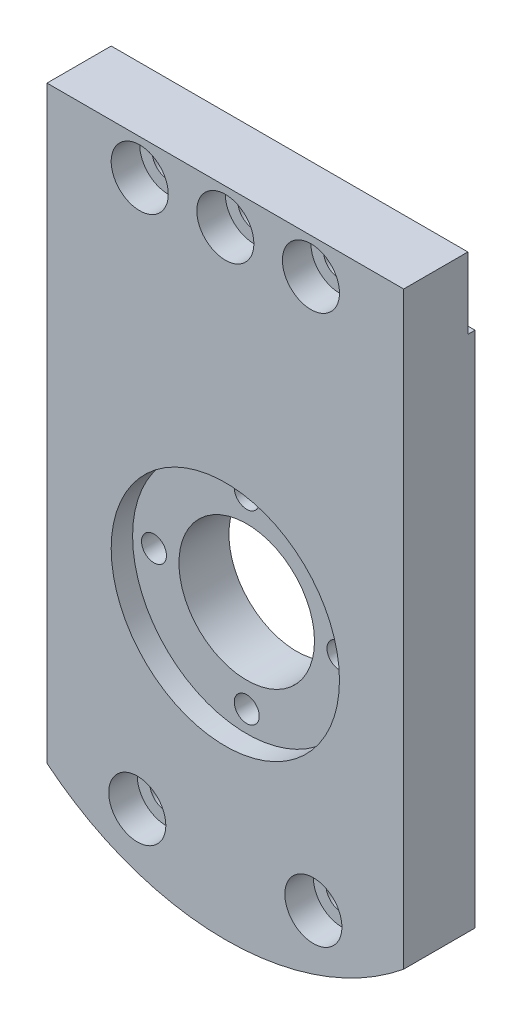
ISO-10303-21;
HEADER;
FILE_DESCRIPTION(('STEP AP214'),'2;1');
FILE_NAME('part.step','',(''),(''),'','','');
FILE_SCHEMA(('AUTOMOTIVE_DESIGN { 1 0 10303 214 1 1 1 1 }'));
ENDSEC;
DATA;
#1=APPLICATION_CONTEXT('core data for automotive mechanical design processes');
#2=APPLICATION_PROTOCOL_DEFINITION('international standard','automotive_design',2000,#1);
#3=PRODUCT_CONTEXT('',#1,'mechanical');
#4=PRODUCT('Part','Part','',(#3));
#5=PRODUCT_RELATED_PRODUCT_CATEGORY('part','',(#4));
#6=PRODUCT_DEFINITION_FORMATION('','',#4);
#7=PRODUCT_DEFINITION_CONTEXT('part definition',#1,'design');
#8=PRODUCT_DEFINITION('design','',#6,#7);
#9=PRODUCT_DEFINITION_SHAPE('','',#8);
#10=(LENGTH_UNIT() NAMED_UNIT(*) SI_UNIT(.MILLI.,.METRE.));
#11=(NAMED_UNIT(*) PLANE_ANGLE_UNIT() SI_UNIT($,.RADIAN.));
#12=(NAMED_UNIT(*) SI_UNIT($,.STERADIAN.) SOLID_ANGLE_UNIT());
#13=UNCERTAINTY_MEASURE_WITH_UNIT(LENGTH_MEASURE(1.E-05),#10,'distance_accuracy_value','');
#14=(GEOMETRIC_REPRESENTATION_CONTEXT(3) GLOBAL_UNCERTAINTY_ASSIGNED_CONTEXT((#13)) GLOBAL_UNIT_ASSIGNED_CONTEXT((#10,
#11,#12)) REPRESENTATION_CONTEXT('',''));
#15=CARTESIAN_POINT('',(0.,0.,0.));
#16=DIRECTION('',(0.,0.,1.));
#17=DIRECTION('',(1.,0.,0.));
#18=AXIS2_PLACEMENT_3D('',#15,#16,#17);
#19=CARTESIAN_POINT('',(13.,0.,10.));
#20=DIRECTION('',(0.,0.,-1.));
#21=DIRECTION('',(-1.,0.,0.));
#22=AXIS2_PLACEMENT_3D('',#19,#20,#21);
#23=CYLINDRICAL_SURFACE('',#22,1.75);
#24=CARTESIAN_POINT('',(13.,0.,7.));
#25=DIRECTION('',(0.,0.,1.));
#26=DIRECTION('',(1.,0.,0.));
#27=AXIS2_PLACEMENT_3D('',#24,#25,#26);
#28=CIRCLE('',#27,1.75);
#29=CARTESIAN_POINT('',(14.75,0.,7.));
#30=VERTEX_POINT('',#29);
#31=EDGE_CURVE('E172',#30,#30,#28,.T.);
#32=ORIENTED_EDGE('',*,*,#31,.T.);
#33=EDGE_LOOP('',(#32));
#34=FACE_BOUND('',#33,.T.);
#35=CARTESIAN_POINT('',(13.,0.,2.));
#36=DIRECTION('',(0.,0.,-1.));
#37=DIRECTION('',(-1.,0.,0.));
#38=AXIS2_PLACEMENT_3D('',#35,#36,#37);
#39=CIRCLE('',#38,1.75);
#40=CARTESIAN_POINT('',(11.25,0.,2.));
#41=VERTEX_POINT('',#40);
#42=EDGE_CURVE('E36',#41,#41,#39,.T.);
#43=ORIENTED_EDGE('',*,*,#42,.T.);
#44=EDGE_LOOP('',(#43));
#45=FACE_BOUND('',#44,.T.);
#46=ADVANCED_FACE('F32',(#34,#45),#23,.F.);
#47=CARTESIAN_POINT('',(0.,-13.,10.));
#48=DIRECTION('',(0.,0.,-1.));
#49=DIRECTION('',(-1.,0.,0.));
#50=AXIS2_PLACEMENT_3D('',#47,#48,#49);
#51=CYLINDRICAL_SURFACE('',#50,1.75);
#52=CARTESIAN_POINT('',(0.,-13.,7.));
#53=DIRECTION('',(0.,0.,1.));
#54=DIRECTION('',(1.,0.,0.));
#55=AXIS2_PLACEMENT_3D('',#52,#53,#54);
#56=CIRCLE('',#55,1.75);
#57=CARTESIAN_POINT('',(1.75,-13.,7.));
#58=VERTEX_POINT('',#57);
#59=EDGE_CURVE('E168',#58,#58,#56,.T.);
#60=ORIENTED_EDGE('',*,*,#59,.T.);
#61=EDGE_LOOP('',(#60));
#62=FACE_BOUND('',#61,.T.);
#63=CARTESIAN_POINT('',(0.,-13.,2.));
#64=DIRECTION('',(0.,0.,-1.));
#65=DIRECTION('',(-1.,0.,0.));
#66=AXIS2_PLACEMENT_3D('',#63,#64,#65);
#67=CIRCLE('',#66,1.75);
#68=CARTESIAN_POINT('',(-1.75,-13.,2.));
#69=VERTEX_POINT('',#68);
#70=EDGE_CURVE('E228',#69,#69,#67,.T.);
#71=ORIENTED_EDGE('',*,*,#70,.T.);
#72=EDGE_LOOP('',(#71));
#73=FACE_BOUND('',#72,.T.);
#74=ADVANCED_FACE('F267',(#62,#73),#51,.F.);
#75=CARTESIAN_POINT('',(-13.,0.,10.));
#76=DIRECTION('',(0.,0.,-1.));
#77=DIRECTION('',(-1.,0.,0.));
#78=AXIS2_PLACEMENT_3D('',#75,#76,#77);
#79=CYLINDRICAL_SURFACE('',#78,1.75);
#80=CARTESIAN_POINT('',(-13.,0.,7.));
#81=DIRECTION('',(0.,0.,1.));
#82=DIRECTION('',(1.,0.,0.));
#83=AXIS2_PLACEMENT_3D('',#80,#81,#82);
#84=CIRCLE('',#83,1.75);
#85=CARTESIAN_POINT('',(-11.25,0.,7.));
#86=VERTEX_POINT('',#85);
#87=EDGE_CURVE('E178',#86,#86,#84,.T.);
#88=ORIENTED_EDGE('',*,*,#87,.T.);
#89=EDGE_LOOP('',(#88));
#90=FACE_BOUND('',#89,.T.);
#91=CARTESIAN_POINT('',(-13.,0.,2.));
#92=DIRECTION('',(0.,0.,-1.));
#93=DIRECTION('',(-1.,0.,0.));
#94=AXIS2_PLACEMENT_3D('',#91,#92,#93);
#95=CIRCLE('',#94,1.75);
#96=CARTESIAN_POINT('',(-14.75,0.,2.));
#97=VERTEX_POINT('',#96);
#98=EDGE_CURVE('E224',#97,#97,#95,.T.);
#99=ORIENTED_EDGE('',*,*,#98,.T.);
#100=EDGE_LOOP('',(#99));
#101=FACE_BOUND('',#100,.T.);
#102=ADVANCED_FACE('F273',(#90,#101),#79,.F.);
#103=CARTESIAN_POINT('',(0.,13.,10.));
#104=DIRECTION('',(0.,0.,-1.));
#105=DIRECTION('',(-1.,0.,0.));
#106=AXIS2_PLACEMENT_3D('',#103,#104,#105);
#107=CYLINDRICAL_SURFACE('',#106,1.75);
#108=CARTESIAN_POINT('',(0.,13.,7.));
#109=DIRECTION('',(0.,0.,1.));
#110=DIRECTION('',(1.,0.,0.));
#111=AXIS2_PLACEMENT_3D('',#108,#109,#110);
#112=CIRCLE('',#111,1.75);
#113=CARTESIAN_POINT('',(1.75,13.,7.));
#114=VERTEX_POINT('',#113);
#115=EDGE_CURVE('E175',#114,#114,#112,.T.);
#116=ORIENTED_EDGE('',*,*,#115,.T.);
#117=EDGE_LOOP('',(#116));
#118=FACE_BOUND('',#117,.T.);
#119=CARTESIAN_POINT('',(0.,13.,2.));
#120=DIRECTION('',(0.,0.,-1.));
#121=DIRECTION('',(-1.,0.,0.));
#122=AXIS2_PLACEMENT_3D('',#119,#120,#121);
#123=CIRCLE('',#122,1.75);
#124=CARTESIAN_POINT('',(-1.75,13.,2.));
#125=VERTEX_POINT('',#124);
#126=EDGE_CURVE('E220',#125,#125,#123,.T.);
#127=ORIENTED_EDGE('',*,*,#126,.T.);
#128=EDGE_LOOP('',(#127));
#129=FACE_BOUND('',#128,.T.);
#130=ADVANCED_FACE('F279',(#118,#129),#107,.F.);
#131=CARTESIAN_POINT('',(12.,47.,10.));
#132=DIRECTION('',(0.,0.,-1.));
#133=DIRECTION('',(-1.,0.,0.));
#134=AXIS2_PLACEMENT_3D('',#131,#132,#133);
#135=CYLINDRICAL_SURFACE('',#134,2.25);
#136=CARTESIAN_POINT('',(12.,47.,6.));
#137=DIRECTION('',(0.,0.,1.));
#138=DIRECTION('',(1.,0.,0.));
#139=AXIS2_PLACEMENT_3D('',#136,#137,#138);
#140=CIRCLE('',#139,2.25);
#141=CARTESIAN_POINT('',(14.25,47.,6.));
#142=VERTEX_POINT('',#141);
#143=EDGE_CURVE('E147',#142,#142,#140,.T.);
#144=ORIENTED_EDGE('',*,*,#143,.T.);
#145=EDGE_LOOP('',(#144));
#146=FACE_BOUND('',#145,.T.);
#147=CARTESIAN_POINT('',(12.,47.,0.999999999999999));
#148=DIRECTION('',(0.,0.,-1.));
#149=DIRECTION('',(-1.,0.,0.));
#150=AXIS2_PLACEMENT_3D('',#147,#148,#149);
#151=CIRCLE('',#150,2.25);
#152=CARTESIAN_POINT('',(9.75,47.,0.999999999999999));
#153=VERTEX_POINT('',#152);
#154=EDGE_CURVE('E127',#153,#153,#151,.T.);
#155=ORIENTED_EDGE('',*,*,#154,.T.);
#156=EDGE_LOOP('',(#155));
#157=FACE_BOUND('',#156,.T.);
#158=ADVANCED_FACE('F282',(#146,#157),#135,.F.);
#159=CARTESIAN_POINT('',(0.,47.,10.));
#160=DIRECTION('',(0.,0.,-1.));
#161=DIRECTION('',(-1.,0.,0.));
#162=AXIS2_PLACEMENT_3D('',#159,#160,#161);
#163=CYLINDRICAL_SURFACE('',#162,2.25);
#164=CARTESIAN_POINT('',(0.,47.,6.));
#165=DIRECTION('',(0.,0.,1.));
#166=DIRECTION('',(1.,0.,0.));
#167=AXIS2_PLACEMENT_3D('',#164,#165,#166);
#168=CIRCLE('',#167,2.25);
#169=CARTESIAN_POINT('',(2.25,47.,6.));
#170=VERTEX_POINT('',#169);
#171=EDGE_CURVE('E154',#170,#170,#168,.T.);
#172=ORIENTED_EDGE('',*,*,#171,.T.);
#173=EDGE_LOOP('',(#172));
#174=FACE_BOUND('',#173,.T.);
#175=CARTESIAN_POINT('',(0.,47.,0.999999999999999));
#176=DIRECTION('',(0.,0.,-1.));
#177=DIRECTION('',(-1.,0.,0.));
#178=AXIS2_PLACEMENT_3D('',#175,#176,#177);
#179=CIRCLE('',#178,2.25);
#180=CARTESIAN_POINT('',(-2.25,47.,0.999999999999999));
#181=VERTEX_POINT('',#180);
#182=EDGE_CURVE('E124',#181,#181,#179,.T.);
#183=ORIENTED_EDGE('',*,*,#182,.T.);
#184=EDGE_LOOP('',(#183));
#185=FACE_BOUND('',#184,.T.);
#186=ADVANCED_FACE('F296',(#174,#185),#163,.F.);
#187=CARTESIAN_POINT('',(-12.,47.,10.));
#188=DIRECTION('',(0.,0.,-1.));
#189=DIRECTION('',(-1.,0.,0.));
#190=AXIS2_PLACEMENT_3D('',#187,#188,#189);
#191=CYLINDRICAL_SURFACE('',#190,2.25);
#192=CARTESIAN_POINT('',(-12.,47.,6.));
#193=DIRECTION('',(0.,0.,1.));
#194=DIRECTION('',(1.,0.,0.));
#195=AXIS2_PLACEMENT_3D('',#192,#193,#194);
#196=CIRCLE('',#195,2.25);
#197=CARTESIAN_POINT('',(-9.75,47.,6.));
#198=VERTEX_POINT('',#197);
#199=EDGE_CURVE('E161',#198,#198,#196,.T.);
#200=ORIENTED_EDGE('',*,*,#199,.T.);
#201=EDGE_LOOP('',(#200));
#202=FACE_BOUND('',#201,.T.);
#203=CARTESIAN_POINT('',(-12.,47.,0.999999999999999));
#204=DIRECTION('',(0.,0.,-1.));
#205=DIRECTION('',(-1.,0.,0.));
#206=AXIS2_PLACEMENT_3D('',#203,#204,#205);
#207=CIRCLE('',#206,2.25);
#208=CARTESIAN_POINT('',(-14.25,47.,0.999999999999999));
#209=VERTEX_POINT('',#208);
#210=EDGE_CURVE('E117',#209,#209,#207,.T.);
#211=ORIENTED_EDGE('',*,*,#210,.T.);
#212=EDGE_LOOP('',(#211));
#213=FACE_BOUND('',#212,.T.);
#214=ADVANCED_FACE('F292',(#202,#213),#191,.F.);
#215=CARTESIAN_POINT('',(-25.,52.,10.));
#216=DIRECTION('',(0.,-1.,0.));
#217=DIRECTION('',(0.,0.,-1.));
#218=AXIS2_PLACEMENT_3D('',#215,#216,#217);
#219=PLANE('',#218);
#220=DIRECTION('',(1.,0.,0.));
#221=VECTOR('',#220,1.);
#222=CARTESIAN_POINT('',(25.,52.,1.));
#223=LINE('',#222,#221);
#224=CARTESIAN_POINT('',(-25.,52.,1.));
#225=VERTEX_POINT('',#224);
#226=CARTESIAN_POINT('',(25.,52.,1.));
#227=VERTEX_POINT('',#226);
#228=EDGE_CURVE('E106',#225,#227,#223,.T.);
#229=ORIENTED_EDGE('',*,*,#228,.F.);
#230=DIRECTION('',(0.,0.,-1.));
#231=VECTOR('',#230,1.);
#232=CARTESIAN_POINT('',(-25.,52.,10.));
#233=LINE('',#232,#231);
#234=CARTESIAN_POINT('',(-25.,52.,10.));
#235=VERTEX_POINT('',#234);
#236=EDGE_CURVE('E200',#235,#225,#233,.T.);
#237=ORIENTED_EDGE('',*,*,#236,.F.);
#238=DIRECTION('',(-1.,0.,0.));
#239=VECTOR('',#238,1.);
#240=CARTESIAN_POINT('',(-25.,52.,10.));
#241=LINE('',#240,#239);
#242=CARTESIAN_POINT('',(25.,52.,10.));
#243=VERTEX_POINT('',#242);
#244=EDGE_CURVE('E198',#243,#235,#241,.T.);
#245=ORIENTED_EDGE('',*,*,#244,.F.);
#246=DIRECTION('',(0.,0.,-1.));
#247=VECTOR('',#246,1.);
#248=CARTESIAN_POINT('',(25.,52.,10.));
#249=LINE('',#248,#247);
#250=EDGE_CURVE('E205',#243,#227,#249,.T.);
#251=ORIENTED_EDGE('',*,*,#250,.T.);
#252=EDGE_LOOP('',(#229,#237,#245,#251));
#253=FACE_BOUND('',#252,.T.);
#254=ADVANCED_FACE('F295',(#253),#219,.F.);
#255=CARTESIAN_POINT('',(-12.3415406937742,-29.795114923489,10.));
#256=DIRECTION('',(0.,0.,-1.));
#257=DIRECTION('',(-1.,0.,0.));
#258=AXIS2_PLACEMENT_3D('',#255,#256,#257);
#259=CYLINDRICAL_SURFACE('',#258,2.25);
#260=CARTESIAN_POINT('',(-12.3415406937742,-29.795114923489,0.));
#261=DIRECTION('',(0.,0.,1.));
#262=DIRECTION('',(1.,0.,0.));
#263=AXIS2_PLACEMENT_3D('',#260,#261,#262);
#264=CIRCLE('',#263,2.25);
#265=CARTESIAN_POINT('',(-10.0915406937742,-29.795114923489,0.));
#266=VERTEX_POINT('',#265);
#267=EDGE_CURVE('E190',#266,#266,#264,.T.);
#268=ORIENTED_EDGE('',*,*,#267,.F.);
#269=EDGE_LOOP('',(#268));
#270=FACE_BOUND('',#269,.T.);
#271=CARTESIAN_POINT('',(-12.3415406937742,-29.795114923489,6.));
#272=DIRECTION('',(0.,0.,1.));
#273=DIRECTION('',(1.,0.,0.));
#274=AXIS2_PLACEMENT_3D('',#271,#272,#273);
#275=CIRCLE('',#274,2.25);
#276=CARTESIAN_POINT('',(-10.0915406937742,-29.795114923489,6.));
#277=VERTEX_POINT('',#276);
#278=EDGE_CURVE('E134',#277,#277,#275,.T.);
#279=ORIENTED_EDGE('',*,*,#278,.T.);
#280=EDGE_LOOP('',(#279));
#281=FACE_BOUND('',#280,.T.);
#282=ADVANCED_FACE('F306',(#270,#281),#259,.F.);
#283=CARTESIAN_POINT('',(12.3415406937742,-29.795114923489,10.));
#284=DIRECTION('',(0.,0.,-1.));
#285=DIRECTION('',(-1.,0.,0.));
#286=AXIS2_PLACEMENT_3D('',#283,#284,#285);
#287=CYLINDRICAL_SURFACE('',#286,2.25);
#288=CARTESIAN_POINT('',(12.3415406937742,-29.795114923489,0.));
#289=DIRECTION('',(0.,0.,1.));
#290=DIRECTION('',(1.,0.,0.));
#291=AXIS2_PLACEMENT_3D('',#288,#289,#290);
#292=CIRCLE('',#291,2.25);
#293=CARTESIAN_POINT('',(14.5915406937742,-29.795114923489,0.));
#294=VERTEX_POINT('',#293);
#295=EDGE_CURVE('E187',#294,#294,#292,.T.);
#296=ORIENTED_EDGE('',*,*,#295,.F.);
#297=EDGE_LOOP('',(#296));
#298=FACE_BOUND('',#297,.T.);
#299=CARTESIAN_POINT('',(12.3415406937742,-29.795114923489,6.));
#300=DIRECTION('',(0.,0.,1.));
#301=DIRECTION('',(1.,0.,0.));
#302=AXIS2_PLACEMENT_3D('',#299,#300,#301);
#303=CIRCLE('',#302,2.25);
#304=CARTESIAN_POINT('',(14.5915406937742,-29.795114923489,6.));
#305=VERTEX_POINT('',#304);
#306=EDGE_CURVE('E140',#305,#305,#303,.T.);
#307=ORIENTED_EDGE('',*,*,#306,.T.);
#308=EDGE_LOOP('',(#307));
#309=FACE_BOUND('',#308,.T.);
#310=ADVANCED_FACE('F290',(#298,#309),#287,.F.);
#311=CARTESIAN_POINT('',(0.,0.,10.));
#312=DIRECTION('',(0.,0.,-1.));
#313=DIRECTION('',(-1.,0.,0.));
#314=AXIS2_PLACEMENT_3D('',#311,#312,#313);
#315=CYLINDRICAL_SURFACE('',#314,9.5);
#316=CARTESIAN_POINT('',(0.,0.,0.));
#317=DIRECTION('',(0.,0.,1.));
#318=DIRECTION('',(1.,0.,0.));
#319=AXIS2_PLACEMENT_3D('',#316,#317,#318);
#320=CIRCLE('',#319,9.5);
#321=CARTESIAN_POINT('',(9.5,0.,0.));
#322=VERTEX_POINT('',#321);
#323=EDGE_CURVE('E184',#322,#322,#320,.T.);
#324=ORIENTED_EDGE('',*,*,#323,.F.);
#325=EDGE_LOOP('',(#324));
#326=FACE_BOUND('',#325,.T.);
#327=CARTESIAN_POINT('',(0.,0.,7.));
#328=DIRECTION('',(0.,0.,1.));
#329=DIRECTION('',(1.,0.,0.));
#330=AXIS2_PLACEMENT_3D('',#327,#328,#329);
#331=CIRCLE('',#330,9.5);
#332=CARTESIAN_POINT('',(9.5,0.,7.));
#333=VERTEX_POINT('',#332);
#334=EDGE_CURVE('E181',#333,#333,#331,.T.);
#335=ORIENTED_EDGE('',*,*,#334,.T.);
#336=EDGE_LOOP('',(#335));
#337=FACE_BOUND('',#336,.T.);
#338=ADVANCED_FACE('F287',(#326,#337),#315,.F.);
#339=CARTESIAN_POINT('',(0.,0.,10.));
#340=DIRECTION('',(0.,0.,1.));
#341=DIRECTION('',(1.,0.,0.));
#342=AXIS2_PLACEMENT_3D('',#339,#340,#341);
#343=PLANE('',#342);
#344=CARTESIAN_POINT('',(-12.3415406937742,-29.795114923489,10.));
#345=DIRECTION('',(0.,0.,1.));
#346=DIRECTION('',(1.,0.,0.));
#347=AXIS2_PLACEMENT_3D('',#344,#345,#346);
#348=CIRCLE('',#347,4.);
#349=CARTESIAN_POINT('',(-8.34154069377417,-29.795114923489,10.));
#350=VERTEX_POINT('',#349);
#351=EDGE_CURVE('E130',#350,#350,#348,.T.);
#352=ORIENTED_EDGE('',*,*,#351,.F.);
#353=EDGE_LOOP('',(#352));
#354=FACE_BOUND('',#353,.T.);
#355=CARTESIAN_POINT('',(12.3415406937742,-29.795114923489,10.));
#356=DIRECTION('',(0.,0.,1.));
#357=DIRECTION('',(1.,0.,0.));
#358=AXIS2_PLACEMENT_3D('',#355,#356,#357);
#359=CIRCLE('',#358,4.);
#360=CARTESIAN_POINT('',(16.3415406937742,-29.795114923489,10.));
#361=VERTEX_POINT('',#360);
#362=EDGE_CURVE('E141',#361,#361,#359,.T.);
#363=ORIENTED_EDGE('',*,*,#362,.F.);
#364=EDGE_LOOP('',(#363));
#365=FACE_BOUND('',#364,.T.);
#366=CARTESIAN_POINT('',(12.,47.,10.));
#367=DIRECTION('',(0.,0.,1.));
#368=DIRECTION('',(1.,0.,0.));
#369=AXIS2_PLACEMENT_3D('',#366,#367,#368);
#370=CIRCLE('',#369,4.);
#371=CARTESIAN_POINT('',(16.,47.,10.));
#372=VERTEX_POINT('',#371);
#373=EDGE_CURVE('E148',#372,#372,#370,.T.);
#374=ORIENTED_EDGE('',*,*,#373,.F.);
#375=EDGE_LOOP('',(#374));
#376=FACE_BOUND('',#375,.T.);
#377=CARTESIAN_POINT('',(0.,47.,10.));
#378=DIRECTION('',(0.,0.,1.));
#379=DIRECTION('',(1.,0.,0.));
#380=AXIS2_PLACEMENT_3D('',#377,#378,#379);
#381=CIRCLE('',#380,4.00000000000001);
#382=CARTESIAN_POINT('',(4.00000000000001,47.,10.));
#383=VERTEX_POINT('',#382);
#384=EDGE_CURVE('E155',#383,#383,#381,.T.);
#385=ORIENTED_EDGE('',*,*,#384,.F.);
#386=EDGE_LOOP('',(#385));
#387=FACE_BOUND('',#386,.T.);
#388=CARTESIAN_POINT('',(-12.,47.,10.));
#389=DIRECTION('',(0.,0.,1.));
#390=DIRECTION('',(1.,0.,0.));
#391=AXIS2_PLACEMENT_3D('',#388,#389,#390);
#392=CIRCLE('',#391,4.);
#393=CARTESIAN_POINT('',(-8.,47.,10.));
#394=VERTEX_POINT('',#393);
#395=EDGE_CURVE('E162',#394,#394,#392,.T.);
#396=ORIENTED_EDGE('',*,*,#395,.F.);
#397=EDGE_LOOP('',(#396));
#398=FACE_BOUND('',#397,.T.);
#399=CARTESIAN_POINT('',(0.,0.,10.));
#400=DIRECTION('',(0.,0.,1.));
#401=DIRECTION('',(1.,0.,0.));
#402=AXIS2_PLACEMENT_3D('',#399,#400,#401);
#403=CIRCLE('',#402,16.);
#404=CARTESIAN_POINT('',(16.,0.,10.));
#405=VERTEX_POINT('',#404);
#406=EDGE_CURVE('E169',#405,#405,#403,.T.);
#407=ORIENTED_EDGE('',*,*,#406,.F.);
#408=EDGE_LOOP('',(#407));
#409=FACE_BOUND('',#408,.T.);
#410=DIRECTION('',(0.,-1.,0.));
#411=VECTOR('',#410,1.);
#412=CARTESIAN_POINT('',(-25.,0.,10.));
#413=LINE('',#412,#411);
#414=CARTESIAN_POINT('',(-25.,-30.581857366746,10.));
#415=VERTEX_POINT('',#414);
#416=EDGE_CURVE('E58',#235,#415,#413,.T.);
#417=ORIENTED_EDGE('',*,*,#416,.T.);
#418=CARTESIAN_POINT('',(0.,0.,10.));
#419=DIRECTION('',(0.,0.,1.));
#420=DIRECTION('',(1.,0.,0.));
#421=AXIS2_PLACEMENT_3D('',#418,#419,#420);
#422=CIRCLE('',#421,39.5);
#423=CARTESIAN_POINT('',(25.,-30.5818573667461,10.));
#424=VERTEX_POINT('',#423);
#425=EDGE_CURVE('E79',#415,#424,#422,.T.);
#426=ORIENTED_EDGE('',*,*,#425,.T.);
#427=DIRECTION('',(0.,1.,0.));
#428=VECTOR('',#427,1.);
#429=CARTESIAN_POINT('',(25.,52.,10.));
#430=LINE('',#429,#428);
#431=EDGE_CURVE('E196',#424,#243,#430,.T.);
#432=ORIENTED_EDGE('',*,*,#431,.T.);
#433=ORIENTED_EDGE('',*,*,#244,.T.);
#434=EDGE_LOOP('',(#417,#426,#432,#433));
#435=FACE_BOUND('',#434,.T.);
#436=ADVANCED_FACE('F263',(#354,#365,#376,#387,#398,#409,#435),#343,.T.);
#437=CARTESIAN_POINT('',(0.,0.,0.));
#438=DIRECTION('',(0.,0.,1.));
#439=DIRECTION('',(1.,0.,0.));
#440=AXIS2_PLACEMENT_3D('',#437,#438,#439);
#441=PLANE('',#440);
#442=CARTESIAN_POINT('',(13.,0.,0.));
#443=DIRECTION('',(0.,0.,-1.));
#444=DIRECTION('',(-1.,0.,0.));
#445=AXIS2_PLACEMENT_3D('',#442,#443,#444);
#446=CIRCLE('',#445,3.25);
#447=CARTESIAN_POINT('',(9.75,0.,0.));
#448=VERTEX_POINT('',#447);
#449=EDGE_CURVE('E244',#448,#448,#446,.T.);
#450=ORIENTED_EDGE('',*,*,#449,.F.);
#451=EDGE_LOOP('',(#450));
#452=FACE_BOUND('',#451,.T.);
#453=CARTESIAN_POINT('',(0.,-13.,0.));
#454=DIRECTION('',(0.,0.,-1.));
#455=DIRECTION('',(-1.,0.,0.));
#456=AXIS2_PLACEMENT_3D('',#453,#454,#455);
#457=CIRCLE('',#456,3.25);
#458=CARTESIAN_POINT('',(-3.25,-13.,0.));
#459=VERTEX_POINT('',#458);
#460=EDGE_CURVE('E237',#459,#459,#457,.T.);
#461=ORIENTED_EDGE('',*,*,#460,.F.);
#462=EDGE_LOOP('',(#461));
#463=FACE_BOUND('',#462,.T.);
#464=CARTESIAN_POINT('',(-13.,0.,0.));
#465=DIRECTION('',(0.,0.,-1.));
#466=DIRECTION('',(-1.,0.,0.));
#467=AXIS2_PLACEMENT_3D('',#464,#465,#466);
#468=CIRCLE('',#467,3.25);
#469=CARTESIAN_POINT('',(-16.25,0.,0.));
#470=VERTEX_POINT('',#469);
#471=EDGE_CURVE('E230',#470,#470,#468,.T.);
#472=ORIENTED_EDGE('',*,*,#471,.F.);
#473=EDGE_LOOP('',(#472));
#474=FACE_BOUND('',#473,.T.);
#475=CARTESIAN_POINT('',(0.,13.,0.));
#476=DIRECTION('',(0.,0.,-1.));
#477=DIRECTION('',(-1.,0.,0.));
#478=AXIS2_PLACEMENT_3D('',#475,#476,#477);
#479=CIRCLE('',#478,3.25);
#480=CARTESIAN_POINT('',(-3.25,13.,0.));
#481=VERTEX_POINT('',#480);
#482=EDGE_CURVE('E226',#481,#481,#479,.T.);
#483=ORIENTED_EDGE('',*,*,#482,.F.);
#484=EDGE_LOOP('',(#483));
#485=FACE_BOUND('',#484,.T.);
#486=ORIENTED_EDGE('',*,*,#267,.T.);
#487=EDGE_LOOP('',(#486));
#488=FACE_BOUND('',#487,.T.);
#489=DIRECTION('',(0.,-1.,0.));
#490=VECTOR('',#489,1.);
#491=CARTESIAN_POINT('',(-25.,0.,0.));
#492=LINE('',#491,#490);
#493=CARTESIAN_POINT('',(-25.,42.,0.));
#494=VERTEX_POINT('',#493);
#495=CARTESIAN_POINT('',(-25.,-30.581857366746,0.));
#496=VERTEX_POINT('',#495);
#497=EDGE_CURVE('E194',#494,#496,#492,.T.);
#498=ORIENTED_EDGE('',*,*,#497,.F.);
#499=DIRECTION('',(-1.,0.,0.));
#500=VECTOR('',#499,1.);
#501=CARTESIAN_POINT('',(25.,42.,0.));
#502=LINE('',#501,#500);
#503=CARTESIAN_POINT('',(25.,42.,0.));
#504=VERTEX_POINT('',#503);
#505=EDGE_CURVE('E110',#504,#494,#502,.T.);
#506=ORIENTED_EDGE('',*,*,#505,.F.);
#507=DIRECTION('',(0.,1.,0.));
#508=VECTOR('',#507,1.);
#509=CARTESIAN_POINT('',(25.,52.,0.));
#510=LINE('',#509,#508);
#511=CARTESIAN_POINT('',(25.,-30.5818573667461,0.));
#512=VERTEX_POINT('',#511);
#513=EDGE_CURVE('E115',#512,#504,#510,.T.);
#514=ORIENTED_EDGE('',*,*,#513,.F.);
#515=CARTESIAN_POINT('',(0.,0.,0.));
#516=DIRECTION('',(0.,0.,1.));
#517=DIRECTION('',(1.,0.,0.));
#518=AXIS2_PLACEMENT_3D('',#515,#516,#517);
#519=CIRCLE('',#518,39.5);
#520=EDGE_CURVE('E74',#496,#512,#519,.T.);
#521=ORIENTED_EDGE('',*,*,#520,.F.);
#522=EDGE_LOOP('',(#498,#506,#514,#521));
#523=FACE_BOUND('',#522,.T.);
#524=ORIENTED_EDGE('',*,*,#295,.T.);
#525=EDGE_LOOP('',(#524));
#526=FACE_BOUND('',#525,.T.);
#527=ORIENTED_EDGE('',*,*,#323,.T.);
#528=EDGE_LOOP('',(#527));
#529=FACE_BOUND('',#528,.T.);
#530=ADVANCED_FACE('F256',(#452,#463,#474,#485,#488,#523,#526,#529),#441,.F.);
#531=CARTESIAN_POINT('',(0.,0.,10.));
#532=DIRECTION('',(0.,0.,-1.));
#533=DIRECTION('',(-1.,0.,0.));
#534=AXIS2_PLACEMENT_3D('',#531,#532,#533);
#535=CYLINDRICAL_SURFACE('',#534,39.5);
#536=ORIENTED_EDGE('',*,*,#520,.T.);
#537=DIRECTION('',(0.,0.,-1.));
#538=VECTOR('',#537,1.);
#539=CARTESIAN_POINT('',(25.,-30.5818573667461,10.));
#540=LINE('',#539,#538);
#541=EDGE_CURVE('E41',#424,#512,#540,.T.);
#542=ORIENTED_EDGE('',*,*,#541,.F.);
#543=ORIENTED_EDGE('',*,*,#425,.F.);
#544=DIRECTION('',(0.,0.,-1.));
#545=VECTOR('',#544,1.);
#546=CARTESIAN_POINT('',(-25.,-30.581857366746,10.));
#547=LINE('',#546,#545);
#548=EDGE_CURVE('E11',#415,#496,#547,.T.);
#549=ORIENTED_EDGE('',*,*,#548,.T.);
#550=EDGE_LOOP('',(#536,#542,#543,#549));
#551=FACE_BOUND('',#550,.T.);
#552=ADVANCED_FACE('F34',(#551),#535,.T.);
#553=CARTESIAN_POINT('',(25.,52.,10.));
#554=DIRECTION('',(-1.,0.,0.));
#555=DIRECTION('',(0.,0.,1.));
#556=AXIS2_PLACEMENT_3D('',#553,#554,#555);
#557=PLANE('',#556);
#558=ORIENTED_EDGE('',*,*,#513,.T.);
#559=DIRECTION('',(0.,0.,-1.));
#560=VECTOR('',#559,1.);
#561=CARTESIAN_POINT('',(25.,42.,1.));
#562=LINE('',#561,#560);
#563=CARTESIAN_POINT('',(25.,42.,1.));
#564=VERTEX_POINT('',#563);
#565=EDGE_CURVE('E95',#564,#504,#562,.T.);
#566=ORIENTED_EDGE('',*,*,#565,.F.);
#567=DIRECTION('',(0.,-1.,0.));
#568=VECTOR('',#567,1.);
#569=CARTESIAN_POINT('',(25.,52.,1.));
#570=LINE('',#569,#568);
#571=EDGE_CURVE('E101',#227,#564,#570,.T.);
#572=ORIENTED_EDGE('',*,*,#571,.F.);
#573=ORIENTED_EDGE('',*,*,#250,.F.);
#574=ORIENTED_EDGE('',*,*,#431,.F.);
#575=ORIENTED_EDGE('',*,*,#541,.T.);
#576=EDGE_LOOP('',(#558,#566,#572,#573,#574,#575));
#577=FACE_BOUND('',#576,.T.);
#578=ADVANCED_FACE('F113',(#577),#557,.F.);
#579=CARTESIAN_POINT('',(-25.,0.,10.));
#580=DIRECTION('',(1.,0.,0.));
#581=DIRECTION('',(0.,0.,-1.));
#582=AXIS2_PLACEMENT_3D('',#579,#580,#581);
#583=PLANE('',#582);
#584=DIRECTION('',(0.,1.,0.));
#585=VECTOR('',#584,1.);
#586=CARTESIAN_POINT('',(-25.,52.,1.));
#587=LINE('',#586,#585);
#588=CARTESIAN_POINT('',(-25.,42.,0.999999999999999));
#589=VERTEX_POINT('',#588);
#590=EDGE_CURVE('E100',#589,#225,#587,.T.);
#591=ORIENTED_EDGE('',*,*,#590,.F.);
#592=DIRECTION('',(0.,0.,-1.));
#593=VECTOR('',#592,1.);
#594=CARTESIAN_POINT('',(-25.,42.,1.));
#595=LINE('',#594,#593);
#596=EDGE_CURVE('E98',#589,#494,#595,.T.);
#597=ORIENTED_EDGE('',*,*,#596,.T.);
#598=ORIENTED_EDGE('',*,*,#497,.T.);
#599=ORIENTED_EDGE('',*,*,#548,.F.);
#600=ORIENTED_EDGE('',*,*,#416,.F.);
#601=ORIENTED_EDGE('',*,*,#236,.T.);
#602=EDGE_LOOP('',(#591,#597,#598,#599,#600,#601));
#603=FACE_BOUND('',#602,.T.);
#604=ADVANCED_FACE('F255',(#603),#583,.F.);
#605=CARTESIAN_POINT('',(0.,0.,7.));
#606=DIRECTION('',(0.,0.,1.));
#607=DIRECTION('',(1.,0.,0.));
#608=AXIS2_PLACEMENT_3D('',#605,#606,#607);
#609=CYLINDRICAL_SURFACE('',#608,16.);
#610=CARTESIAN_POINT('',(0.,0.,7.));
#611=DIRECTION('',(0.,0.,1.));
#612=DIRECTION('',(1.,0.,0.));
#613=AXIS2_PLACEMENT_3D('',#610,#611,#612);
#614=CIRCLE('',#613,16.);
#615=CARTESIAN_POINT('',(16.,0.,7.));
#616=VERTEX_POINT('',#615);
#617=EDGE_CURVE('E165',#616,#616,#614,.T.);
#618=ORIENTED_EDGE('',*,*,#617,.F.);
#619=EDGE_LOOP('',(#618));
#620=FACE_BOUND('',#619,.T.);
#621=ORIENTED_EDGE('',*,*,#406,.T.);
#622=EDGE_LOOP('',(#621));
#623=FACE_BOUND('',#622,.T.);
#624=ADVANCED_FACE('F316',(#620,#623),#609,.F.);
#625=CARTESIAN_POINT('',(0.,0.,7.));
#626=DIRECTION('',(0.,0.,1.));
#627=DIRECTION('',(1.,0.,0.));
#628=AXIS2_PLACEMENT_3D('',#625,#626,#627);
#629=PLANE('',#628);
#630=ORIENTED_EDGE('',*,*,#334,.F.);
#631=EDGE_LOOP('',(#630));
#632=FACE_BOUND('',#631,.T.);
#633=ORIENTED_EDGE('',*,*,#87,.F.);
#634=EDGE_LOOP('',(#633));
#635=FACE_BOUND('',#634,.T.);
#636=ORIENTED_EDGE('',*,*,#115,.F.);
#637=EDGE_LOOP('',(#636));
#638=FACE_BOUND('',#637,.T.);
#639=ORIENTED_EDGE('',*,*,#31,.F.);
#640=EDGE_LOOP('',(#639));
#641=FACE_BOUND('',#640,.T.);
#642=ORIENTED_EDGE('',*,*,#59,.F.);
#643=EDGE_LOOP('',(#642));
#644=FACE_BOUND('',#643,.T.);
#645=ORIENTED_EDGE('',*,*,#617,.T.);
#646=EDGE_LOOP('',(#645));
#647=FACE_BOUND('',#646,.T.);
#648=ADVANCED_FACE('F488',(#632,#635,#638,#641,#644,#647),#629,.T.);
#649=CARTESIAN_POINT('',(-12.,47.,6.));
#650=DIRECTION('',(0.,0.,1.));
#651=DIRECTION('',(1.,0.,0.));
#652=AXIS2_PLACEMENT_3D('',#649,#650,#651);
#653=CYLINDRICAL_SURFACE('',#652,4.);
#654=CARTESIAN_POINT('',(-12.,47.,6.));
#655=DIRECTION('',(0.,0.,1.));
#656=DIRECTION('',(1.,0.,0.));
#657=AXIS2_PLACEMENT_3D('',#654,#655,#656);
#658=CIRCLE('',#657,4.);
#659=CARTESIAN_POINT('',(-8.,47.,6.));
#660=VERTEX_POINT('',#659);
#661=EDGE_CURVE('E158',#660,#660,#658,.T.);
#662=ORIENTED_EDGE('',*,*,#661,.F.);
#663=EDGE_LOOP('',(#662));
#664=FACE_BOUND('',#663,.T.);
#665=ORIENTED_EDGE('',*,*,#395,.T.);
#666=EDGE_LOOP('',(#665));
#667=FACE_BOUND('',#666,.T.);
#668=ADVANCED_FACE('F484',(#664,#667),#653,.F.);
#669=CARTESIAN_POINT('',(-12.,47.,6.));
#670=DIRECTION('',(0.,0.,1.));
#671=DIRECTION('',(1.,0.,0.));
#672=AXIS2_PLACEMENT_3D('',#669,#670,#671);
#673=PLANE('',#672);
#674=ORIENTED_EDGE('',*,*,#199,.F.);
#675=EDGE_LOOP('',(#674));
#676=FACE_BOUND('',#675,.T.);
#677=ORIENTED_EDGE('',*,*,#661,.T.);
#678=EDGE_LOOP('',(#677));
#679=FACE_BOUND('',#678,.T.);
#680=ADVANCED_FACE('F480',(#676,#679),#673,.T.);
#681=CARTESIAN_POINT('',(0.,47.,6.));
#682=DIRECTION('',(0.,0.,1.));
#683=DIRECTION('',(1.,0.,0.));
#684=AXIS2_PLACEMENT_3D('',#681,#682,#683);
#685=CYLINDRICAL_SURFACE('',#684,4.00000000000001);
#686=CARTESIAN_POINT('',(0.,47.,6.));
#687=DIRECTION('',(0.,0.,1.));
#688=DIRECTION('',(1.,0.,0.));
#689=AXIS2_PLACEMENT_3D('',#686,#687,#688);
#690=CIRCLE('',#689,4.00000000000001);
#691=CARTESIAN_POINT('',(4.00000000000001,47.,6.));
#692=VERTEX_POINT('',#691);
#693=EDGE_CURVE('E151',#692,#692,#690,.T.);
#694=ORIENTED_EDGE('',*,*,#693,.F.);
#695=EDGE_LOOP('',(#694));
#696=FACE_BOUND('',#695,.T.);
#697=ORIENTED_EDGE('',*,*,#384,.T.);
#698=EDGE_LOOP('',(#697));
#699=FACE_BOUND('',#698,.T.);
#700=ADVANCED_FACE('F476',(#696,#699),#685,.F.);
#701=CARTESIAN_POINT('',(0.,47.,6.));
#702=DIRECTION('',(0.,0.,1.));
#703=DIRECTION('',(1.,0.,0.));
#704=AXIS2_PLACEMENT_3D('',#701,#702,#703);
#705=PLANE('',#704);
#706=ORIENTED_EDGE('',*,*,#171,.F.);
#707=EDGE_LOOP('',(#706));
#708=FACE_BOUND('',#707,.T.);
#709=ORIENTED_EDGE('',*,*,#693,.T.);
#710=EDGE_LOOP('',(#709));
#711=FACE_BOUND('',#710,.T.);
#712=ADVANCED_FACE('F472',(#708,#711),#705,.T.);
#713=CARTESIAN_POINT('',(12.,47.,6.));
#714=DIRECTION('',(0.,0.,1.));
#715=DIRECTION('',(1.,0.,0.));
#716=AXIS2_PLACEMENT_3D('',#713,#714,#715);
#717=CYLINDRICAL_SURFACE('',#716,4.);
#718=CARTESIAN_POINT('',(12.,47.,6.));
#719=DIRECTION('',(0.,0.,1.));
#720=DIRECTION('',(1.,0.,0.));
#721=AXIS2_PLACEMENT_3D('',#718,#719,#720);
#722=CIRCLE('',#721,4.);
#723=CARTESIAN_POINT('',(16.,47.,6.));
#724=VERTEX_POINT('',#723);
#725=EDGE_CURVE('E144',#724,#724,#722,.T.);
#726=ORIENTED_EDGE('',*,*,#725,.F.);
#727=EDGE_LOOP('',(#726));
#728=FACE_BOUND('',#727,.T.);
#729=ORIENTED_EDGE('',*,*,#373,.T.);
#730=EDGE_LOOP('',(#729));
#731=FACE_BOUND('',#730,.T.);
#732=ADVANCED_FACE('F468',(#728,#731),#717,.F.);
#733=CARTESIAN_POINT('',(12.,47.,6.));
#734=DIRECTION('',(0.,0.,1.));
#735=DIRECTION('',(1.,0.,0.));
#736=AXIS2_PLACEMENT_3D('',#733,#734,#735);
#737=PLANE('',#736);
#738=ORIENTED_EDGE('',*,*,#143,.F.);
#739=EDGE_LOOP('',(#738));
#740=FACE_BOUND('',#739,.T.);
#741=ORIENTED_EDGE('',*,*,#725,.T.);
#742=EDGE_LOOP('',(#741));
#743=FACE_BOUND('',#742,.T.);
#744=ADVANCED_FACE('F464',(#740,#743),#737,.T.);
#745=CARTESIAN_POINT('',(12.3415406937742,-29.795114923489,6.));
#746=DIRECTION('',(0.,0.,1.));
#747=DIRECTION('',(1.,0.,0.));
#748=AXIS2_PLACEMENT_3D('',#745,#746,#747);
#749=CYLINDRICAL_SURFACE('',#748,4.);
#750=CARTESIAN_POINT('',(12.3415406937742,-29.795114923489,6.));
#751=DIRECTION('',(0.,0.,1.));
#752=DIRECTION('',(1.,0.,0.));
#753=AXIS2_PLACEMENT_3D('',#750,#751,#752);
#754=CIRCLE('',#753,4.);
#755=CARTESIAN_POINT('',(16.3415406937742,-29.795114923489,6.));
#756=VERTEX_POINT('',#755);
#757=EDGE_CURVE('E137',#756,#756,#754,.T.);
#758=ORIENTED_EDGE('',*,*,#757,.F.);
#759=EDGE_LOOP('',(#758));
#760=FACE_BOUND('',#759,.T.);
#761=ORIENTED_EDGE('',*,*,#362,.T.);
#762=EDGE_LOOP('',(#761));
#763=FACE_BOUND('',#762,.T.);
#764=ADVANCED_FACE('F460',(#760,#763),#749,.F.);
#765=CARTESIAN_POINT('',(12.3415406937742,-29.795114923489,6.));
#766=DIRECTION('',(0.,0.,1.));
#767=DIRECTION('',(1.,0.,0.));
#768=AXIS2_PLACEMENT_3D('',#765,#766,#767);
#769=PLANE('',#768);
#770=ORIENTED_EDGE('',*,*,#306,.F.);
#771=EDGE_LOOP('',(#770));
#772=FACE_BOUND('',#771,.T.);
#773=ORIENTED_EDGE('',*,*,#757,.T.);
#774=EDGE_LOOP('',(#773));
#775=FACE_BOUND('',#774,.T.);
#776=ADVANCED_FACE('F456',(#772,#775),#769,.T.);
#777=CARTESIAN_POINT('',(-12.3415406937742,-29.795114923489,6.));
#778=DIRECTION('',(0.,0.,1.));
#779=DIRECTION('',(1.,0.,0.));
#780=AXIS2_PLACEMENT_3D('',#777,#778,#779);
#781=CYLINDRICAL_SURFACE('',#780,4.);
#782=CARTESIAN_POINT('',(-12.3415406937742,-29.795114923489,6.));
#783=DIRECTION('',(0.,0.,1.));
#784=DIRECTION('',(1.,0.,0.));
#785=AXIS2_PLACEMENT_3D('',#782,#783,#784);
#786=CIRCLE('',#785,4.);
#787=CARTESIAN_POINT('',(-8.34154069377417,-29.795114923489,6.));
#788=VERTEX_POINT('',#787);
#789=EDGE_CURVE('E131',#788,#788,#786,.T.);
#790=ORIENTED_EDGE('',*,*,#789,.F.);
#791=EDGE_LOOP('',(#790));
#792=FACE_BOUND('',#791,.T.);
#793=ORIENTED_EDGE('',*,*,#351,.T.);
#794=EDGE_LOOP('',(#793));
#795=FACE_BOUND('',#794,.T.);
#796=ADVANCED_FACE('F452',(#792,#795),#781,.F.);
#797=CARTESIAN_POINT('',(-12.3415406937742,-29.795114923489,6.));
#798=DIRECTION('',(0.,0.,1.));
#799=DIRECTION('',(1.,0.,0.));
#800=AXIS2_PLACEMENT_3D('',#797,#798,#799);
#801=PLANE('',#800);
#802=ORIENTED_EDGE('',*,*,#278,.F.);
#803=EDGE_LOOP('',(#802));
#804=FACE_BOUND('',#803,.T.);
#805=ORIENTED_EDGE('',*,*,#789,.T.);
#806=EDGE_LOOP('',(#805));
#807=FACE_BOUND('',#806,.T.);
#808=ADVANCED_FACE('F449',(#804,#807),#801,.T.);
#809=CARTESIAN_POINT('',(25.,42.,1.));
#810=DIRECTION('',(0.,-1.,0.));
#811=DIRECTION('',(0.,0.,-1.));
#812=AXIS2_PLACEMENT_3D('',#809,#810,#811);
#813=PLANE('',#812);
#814=ORIENTED_EDGE('',*,*,#505,.T.);
#815=ORIENTED_EDGE('',*,*,#596,.F.);
#816=DIRECTION('',(-1.,0.,0.));
#817=VECTOR('',#816,1.);
#818=CARTESIAN_POINT('',(25.,42.,1.));
#819=LINE('',#818,#817);
#820=EDGE_CURVE('E49',#564,#589,#819,.T.);
#821=ORIENTED_EDGE('',*,*,#820,.F.);
#822=ORIENTED_EDGE('',*,*,#565,.T.);
#823=EDGE_LOOP('',(#814,#815,#821,#822));
#824=FACE_BOUND('',#823,.T.);
#825=ADVANCED_FACE('F93',(#824),#813,.F.);
#826=CARTESIAN_POINT('',(0.,0.,1.));
#827=DIRECTION('',(0.,0.,-1.));
#828=DIRECTION('',(-1.,0.,0.));
#829=AXIS2_PLACEMENT_3D('',#826,#827,#828);
#830=PLANE('',#829);
#831=ORIENTED_EDGE('',*,*,#154,.F.);
#832=EDGE_LOOP('',(#831));
#833=FACE_BOUND('',#832,.T.);
#834=ORIENTED_EDGE('',*,*,#182,.F.);
#835=EDGE_LOOP('',(#834));
#836=FACE_BOUND('',#835,.T.);
#837=ORIENTED_EDGE('',*,*,#210,.F.);
#838=EDGE_LOOP('',(#837));
#839=FACE_BOUND('',#838,.T.);
#840=ORIENTED_EDGE('',*,*,#571,.T.);
#841=ORIENTED_EDGE('',*,*,#820,.T.);
#842=ORIENTED_EDGE('',*,*,#590,.T.);
#843=ORIENTED_EDGE('',*,*,#228,.T.);
#844=EDGE_LOOP('',(#840,#841,#842,#843));
#845=FACE_BOUND('',#844,.T.);
#846=ADVANCED_FACE('F104',(#833,#836,#839,#845),#830,.T.);
#847=CARTESIAN_POINT('',(0.,13.,2.));
#848=DIRECTION('',(0.,0.,-1.));
#849=DIRECTION('',(-1.,0.,0.));
#850=AXIS2_PLACEMENT_3D('',#847,#848,#849);
#851=CYLINDRICAL_SURFACE('',#850,3.25);
#852=CARTESIAN_POINT('',(0.,13.,2.));
#853=DIRECTION('',(0.,0.,-1.));
#854=DIRECTION('',(-1.,0.,0.));
#855=AXIS2_PLACEMENT_3D('',#852,#853,#854);
#856=CIRCLE('',#855,3.25);
#857=CARTESIAN_POINT('',(-3.25,13.,2.));
#858=VERTEX_POINT('',#857);
#859=EDGE_CURVE('E223',#858,#858,#856,.T.);
#860=ORIENTED_EDGE('',*,*,#859,.F.);
#861=EDGE_LOOP('',(#860));
#862=FACE_BOUND('',#861,.T.);
#863=ORIENTED_EDGE('',*,*,#482,.T.);
#864=EDGE_LOOP('',(#863));
#865=FACE_BOUND('',#864,.T.);
#866=ADVANCED_FACE('F361',(#862,#865),#851,.F.);
#867=CARTESIAN_POINT('',(0.,13.,2.));
#868=DIRECTION('',(0.,0.,-1.));
#869=DIRECTION('',(-1.,0.,0.));
#870=AXIS2_PLACEMENT_3D('',#867,#868,#869);
#871=PLANE('',#870);
#872=ORIENTED_EDGE('',*,*,#126,.F.);
#873=EDGE_LOOP('',(#872));
#874=FACE_BOUND('',#873,.T.);
#875=ORIENTED_EDGE('',*,*,#859,.T.);
#876=EDGE_LOOP('',(#875));
#877=FACE_BOUND('',#876,.T.);
#878=ADVANCED_FACE('F366',(#874,#877),#871,.T.);
#879=CARTESIAN_POINT('',(-13.,0.,2.));
#880=DIRECTION('',(0.,0.,-1.));
#881=DIRECTION('',(-1.,0.,0.));
#882=AXIS2_PLACEMENT_3D('',#879,#880,#881);
#883=CYLINDRICAL_SURFACE('',#882,3.25);
#884=CARTESIAN_POINT('',(-13.,0.,2.));
#885=DIRECTION('',(0.,0.,-1.));
#886=DIRECTION('',(-1.,0.,0.));
#887=AXIS2_PLACEMENT_3D('',#884,#885,#886);
#888=CIRCLE('',#887,3.25);
#889=CARTESIAN_POINT('',(-16.25,0.,2.));
#890=VERTEX_POINT('',#889);
#891=EDGE_CURVE('E227',#890,#890,#888,.T.);
#892=ORIENTED_EDGE('',*,*,#891,.F.);
#893=EDGE_LOOP('',(#892));
#894=FACE_BOUND('',#893,.T.);
#895=ORIENTED_EDGE('',*,*,#471,.T.);
#896=EDGE_LOOP('',(#895));
#897=FACE_BOUND('',#896,.T.);
#898=ADVANCED_FACE('F378',(#894,#897),#883,.F.);
#899=CARTESIAN_POINT('',(-13.,0.,2.));
#900=DIRECTION('',(0.,0.,-1.));
#901=DIRECTION('',(-1.,0.,0.));
#902=AXIS2_PLACEMENT_3D('',#899,#900,#901);
#903=PLANE('',#902);
#904=ORIENTED_EDGE('',*,*,#98,.F.);
#905=EDGE_LOOP('',(#904));
#906=FACE_BOUND('',#905,.T.);
#907=ORIENTED_EDGE('',*,*,#891,.T.);
#908=EDGE_LOOP('',(#907));
#909=FACE_BOUND('',#908,.T.);
#910=ADVANCED_FACE('F388',(#906,#909),#903,.T.);
#911=CARTESIAN_POINT('',(0.,-13.,2.));
#912=DIRECTION('',(0.,0.,-1.));
#913=DIRECTION('',(-1.,0.,0.));
#914=AXIS2_PLACEMENT_3D('',#911,#912,#913);
#915=CYLINDRICAL_SURFACE('',#914,3.25);
#916=CARTESIAN_POINT('',(0.,-13.,2.));
#917=DIRECTION('',(0.,0.,-1.));
#918=DIRECTION('',(-1.,0.,0.));
#919=AXIS2_PLACEMENT_3D('',#916,#917,#918);
#920=CIRCLE('',#919,3.25);
#921=CARTESIAN_POINT('',(-3.25,-13.,2.));
#922=VERTEX_POINT('',#921);
#923=EDGE_CURVE('E231',#922,#922,#920,.T.);
#924=ORIENTED_EDGE('',*,*,#923,.F.);
#925=EDGE_LOOP('',(#924));
#926=FACE_BOUND('',#925,.T.);
#927=ORIENTED_EDGE('',*,*,#460,.T.);
#928=EDGE_LOOP('',(#927));
#929=FACE_BOUND('',#928,.T.);
#930=ADVANCED_FACE('F398',(#926,#929),#915,.F.);
#931=CARTESIAN_POINT('',(0.,-13.,2.));
#932=DIRECTION('',(0.,0.,-1.));
#933=DIRECTION('',(-1.,0.,0.));
#934=AXIS2_PLACEMENT_3D('',#931,#932,#933);
#935=PLANE('',#934);
#936=ORIENTED_EDGE('',*,*,#70,.F.);
#937=EDGE_LOOP('',(#936));
#938=FACE_BOUND('',#937,.T.);
#939=ORIENTED_EDGE('',*,*,#923,.T.);
#940=EDGE_LOOP('',(#939));
#941=FACE_BOUND('',#940,.T.);
#942=ADVANCED_FACE('F408',(#938,#941),#935,.T.);
#943=CARTESIAN_POINT('',(13.,0.,2.));
#944=DIRECTION('',(0.,0.,-1.));
#945=DIRECTION('',(-1.,0.,0.));
#946=AXIS2_PLACEMENT_3D('',#943,#944,#945);
#947=CYLINDRICAL_SURFACE('',#946,3.25);
#948=CARTESIAN_POINT('',(13.,0.,2.));
#949=DIRECTION('',(0.,0.,-1.));
#950=DIRECTION('',(-1.,0.,0.));
#951=AXIS2_PLACEMENT_3D('',#948,#949,#950);
#952=CIRCLE('',#951,3.25);
#953=CARTESIAN_POINT('',(9.75,0.,2.));
#954=VERTEX_POINT('',#953);
#955=EDGE_CURVE('E706',#954,#954,#952,.T.);
#956=ORIENTED_EDGE('',*,*,#955,.F.);
#957=EDGE_LOOP('',(#956));
#958=FACE_BOUND('',#957,.T.);
#959=ORIENTED_EDGE('',*,*,#449,.T.);
#960=EDGE_LOOP('',(#959));
#961=FACE_BOUND('',#960,.T.);
#962=ADVANCED_FACE('F418',(#958,#961),#947,.F.);
#963=CARTESIAN_POINT('',(13.,0.,2.));
#964=DIRECTION('',(0.,0.,-1.));
#965=DIRECTION('',(-1.,0.,0.));
#966=AXIS2_PLACEMENT_3D('',#963,#964,#965);
#967=PLANE('',#966);
#968=ORIENTED_EDGE('',*,*,#42,.F.);
#969=EDGE_LOOP('',(#968));
#970=FACE_BOUND('',#969,.T.);
#971=ORIENTED_EDGE('',*,*,#955,.T.);
#972=EDGE_LOOP('',(#971));
#973=FACE_BOUND('',#972,.T.);
#974=ADVANCED_FACE('F428',(#970,#973),#967,.T.);
#975=CLOSED_SHELL('',(#46,#74,#102,#130,#158,#186,#214,#254,#282,#310,#338,#436,#530,#552,#578,
#604,#624,#648,#668,#680,#700,#712,#732,#744,#764,#776,#796,#808,#825,#846,#866,#878,#898,#910,
#930,#942,#962,#974));
#976=MANIFOLD_SOLID_BREP('B2',#975);
#977=ADVANCED_BREP_SHAPE_REPRESENTATION('',(#18,#976),#14);
#978=SHAPE_DEFINITION_REPRESENTATION(#9,#977);
ENDSEC;
END-ISO-10303-21;
